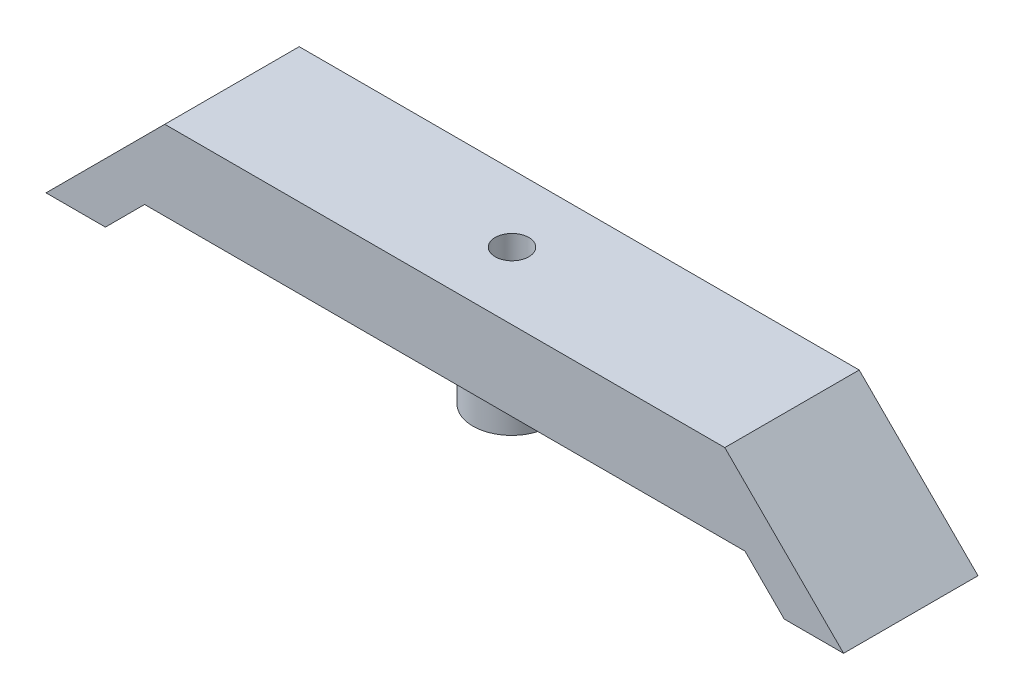
ISO-10303-21;
HEADER;
FILE_DESCRIPTION(('STEP AP214'),'2;1');
FILE_NAME('part.step','',(''),(''),'','','');
FILE_SCHEMA(('AUTOMOTIVE_DESIGN { 1 0 10303 214 1 1 1 1 }'));
ENDSEC;
DATA;
#1=APPLICATION_CONTEXT('core data for automotive mechanical design processes');
#2=APPLICATION_PROTOCOL_DEFINITION('international standard','automotive_design',2000,#1);
#3=PRODUCT_CONTEXT('',#1,'mechanical');
#4=PRODUCT('Part','Part','',(#3));
#5=PRODUCT_RELATED_PRODUCT_CATEGORY('part','',(#4));
#6=PRODUCT_DEFINITION_FORMATION('','',#4);
#7=PRODUCT_DEFINITION_CONTEXT('part definition',#1,'design');
#8=PRODUCT_DEFINITION('design','',#6,#7);
#9=PRODUCT_DEFINITION_SHAPE('','',#8);
#10=(LENGTH_UNIT() NAMED_UNIT(*) SI_UNIT(.MILLI.,.METRE.));
#11=(NAMED_UNIT(*) PLANE_ANGLE_UNIT() SI_UNIT($,.RADIAN.));
#12=(NAMED_UNIT(*) SI_UNIT($,.STERADIAN.) SOLID_ANGLE_UNIT());
#13=UNCERTAINTY_MEASURE_WITH_UNIT(LENGTH_MEASURE(1.E-05),#10,'distance_accuracy_value','');
#14=(GEOMETRIC_REPRESENTATION_CONTEXT(3) GLOBAL_UNCERTAINTY_ASSIGNED_CONTEXT((#13)) GLOBAL_UNIT_ASSIGNED_CONTEXT((#10,
#11,#12)) REPRESENTATION_CONTEXT('',''));
#15=CARTESIAN_POINT('',(0.,0.,0.));
#16=DIRECTION('',(0.,0.,1.));
#17=DIRECTION('',(1.,0.,0.));
#18=AXIS2_PLACEMENT_3D('',#15,#16,#17);
#19=CARTESIAN_POINT('',(-51.8024479254837,-7.10574878438281,12.));
#20=DIRECTION('',(0.,1.,0.));
#21=DIRECTION('',(0.,0.,1.));
#22=AXIS2_PLACEMENT_3D('',#19,#20,#21);
#23=PLANE('',#22);
#24=CARTESIAN_POINT('',(-25.,-7.10574878438281,6.));
#25=DIRECTION('',(0.,-1.,0.));
#26=DIRECTION('',(0.,0.,-1.));
#27=AXIS2_PLACEMENT_3D('',#24,#25,#26);
#28=CIRCLE('',#27,1.5);
#29=CARTESIAN_POINT('',(-24.9600605318817,-7.10574878438281,4.50053181464679));
#30=VERTEX_POINT('',#29);
#31=EDGE_CURVE('E225',#30,#30,#28,.T.);
#32=ORIENTED_EDGE('',*,*,#31,.F.);
#33=CARTESIAN_POINT('',(-25.0009057181842,-7.10574878438281,6.03400384797527));
#34=DIRECTION('',(0.,-1.,0.));
#35=DIRECTION('',(0.,0.,-1.));
#36=AXIS2_PLACEMENT_3D('',#33,#34,#35);
#37=CIRCLE('',#36,1.5340159080807);
#38=EDGE_CURVE('E55',#30,#30,#37,.T.);
#39=ORIENTED_EDGE('',*,*,#38,.T.);
#40=EDGE_LOOP('',(#32,#39));
#41=FACE_BOUND('',#40,.T.);
#42=ADVANCED_FACE('F41',(#41),#23,.F.);
#43=CARTESIAN_POINT('',(0.,0.,12.));
#44=DIRECTION('',(-0.707106781186547,-0.707106781186547,0.));
#45=DIRECTION('',(0.707106781186548,-0.707106781186548,0.));
#46=AXIS2_PLACEMENT_3D('',#43,#44,#45);
#47=PLANE('',#46);
#48=DIRECTION('',(-0.707106781186548,0.707106781186548,0.));
#49=VECTOR('',#48,1.);
#50=CARTESIAN_POINT('',(0.,0.,0.));
#51=LINE('',#50,#49);
#52=CARTESIAN_POINT('',(10.6066017177982,-10.6066017177982,0.));
#53=VERTEX_POINT('',#52);
#54=CARTESIAN_POINT('',(0.,0.,0.));
#55=VERTEX_POINT('',#54);
#56=EDGE_CURVE('E149',#53,#55,#51,.T.);
#57=ORIENTED_EDGE('',*,*,#56,.T.);
#58=DIRECTION('',(0.,0.,-1.));
#59=VECTOR('',#58,1.);
#60=CARTESIAN_POINT('',(0.,0.,12.));
#61=LINE('',#60,#59);
#62=CARTESIAN_POINT('',(0.,0.,12.));
#63=VERTEX_POINT('',#62);
#64=EDGE_CURVE('E50',#63,#55,#61,.T.);
#65=ORIENTED_EDGE('',*,*,#64,.F.);
#66=DIRECTION('',(-0.707106781186548,0.707106781186548,0.));
#67=VECTOR('',#66,1.);
#68=CARTESIAN_POINT('',(0.,0.,12.));
#69=LINE('',#68,#67);
#70=CARTESIAN_POINT('',(10.6066017177982,-10.6066017177982,12.));
#71=VERTEX_POINT('',#70);
#72=EDGE_CURVE('E173',#71,#63,#69,.T.);
#73=ORIENTED_EDGE('',*,*,#72,.F.);
#74=DIRECTION('',(0.,0.,-1.));
#75=VECTOR('',#74,1.);
#76=CARTESIAN_POINT('',(10.6066017177982,-10.6066017177982,12.));
#77=LINE('',#76,#75);
#78=EDGE_CURVE('E145',#71,#53,#77,.T.);
#79=ORIENTED_EDGE('',*,*,#78,.T.);
#80=EDGE_LOOP('',(#57,#65,#73,#79));
#81=FACE_BOUND('',#80,.T.);
#82=ADVANCED_FACE('F43',(#81),#47,.F.);
#83=CARTESIAN_POINT('',(0.,0.,12.));
#84=DIRECTION('',(0.,-1.,0.));
#85=DIRECTION('',(1.,0.,0.));
#86=AXIS2_PLACEMENT_3D('',#83,#84,#85);
#87=PLANE('',#86);
#88=CARTESIAN_POINT('',(-25.,0.,6.));
#89=DIRECTION('',(0.,-1.,0.));
#90=DIRECTION('',(1.,0.,0.));
#91=AXIS2_PLACEMENT_3D('',#88,#89,#90);
#92=CIRCLE('',#91,1.5);
#93=CARTESIAN_POINT('',(-23.5,0.,6.));
#94=VERTEX_POINT('',#93);
#95=EDGE_CURVE('E154',#94,#94,#92,.T.);
#96=ORIENTED_EDGE('',*,*,#95,.T.);
#97=EDGE_LOOP('',(#96));
#98=FACE_BOUND('',#97,.T.);
#99=DIRECTION('',(-1.,0.,0.));
#100=VECTOR('',#99,1.);
#101=CARTESIAN_POINT('',(0.,0.,0.));
#102=LINE('',#101,#100);
#103=CARTESIAN_POINT('',(-50.,0.,0.));
#104=VERTEX_POINT('',#103);
#105=EDGE_CURVE('E153',#55,#104,#102,.T.);
#106=ORIENTED_EDGE('',*,*,#105,.T.);
#107=DIRECTION('',(0.,0.,-1.));
#108=VECTOR('',#107,1.);
#109=CARTESIAN_POINT('',(-50.,0.,12.));
#110=LINE('',#109,#108);
#111=CARTESIAN_POINT('',(-50.,0.,12.));
#112=VERTEX_POINT('',#111);
#113=EDGE_CURVE('E188',#112,#104,#110,.T.);
#114=ORIENTED_EDGE('',*,*,#113,.F.);
#115=DIRECTION('',(-1.,0.,0.));
#116=VECTOR('',#115,1.);
#117=CARTESIAN_POINT('',(0.,0.,12.));
#118=LINE('',#117,#116);
#119=EDGE_CURVE('E104',#63,#112,#118,.T.);
#120=ORIENTED_EDGE('',*,*,#119,.F.);
#121=ORIENTED_EDGE('',*,*,#64,.T.);
#122=EDGE_LOOP('',(#106,#114,#120,#121));
#123=FACE_BOUND('',#122,.T.);
#124=ADVANCED_FACE('F193',(#98,#123),#87,.F.);
#125=CARTESIAN_POINT('',(-50.,0.,12.));
#126=DIRECTION('',(0.707106781186547,-0.707106781186548,0.));
#127=DIRECTION('',(0.707106781186548,0.707106781186547,0.));
#128=AXIS2_PLACEMENT_3D('',#125,#126,#127);
#129=PLANE('',#128);
#130=DIRECTION('',(-0.707106781186548,-0.707106781186547,0.));
#131=VECTOR('',#130,1.);
#132=CARTESIAN_POINT('',(-50.,0.,0.));
#133=LINE('',#132,#131);
#134=CARTESIAN_POINT('',(-60.6066017177982,-10.6066017177982,0.));
#135=VERTEX_POINT('',#134);
#136=EDGE_CURVE('E157',#104,#135,#133,.T.);
#137=ORIENTED_EDGE('',*,*,#136,.T.);
#138=DIRECTION('',(0.,0.,-1.));
#139=VECTOR('',#138,1.);
#140=CARTESIAN_POINT('',(-60.6066017177982,-10.6066017177982,12.));
#141=LINE('',#140,#139);
#142=CARTESIAN_POINT('',(-60.6066017177982,-10.6066017177982,12.));
#143=VERTEX_POINT('',#142);
#144=EDGE_CURVE('E184',#143,#135,#141,.T.);
#145=ORIENTED_EDGE('',*,*,#144,.F.);
#146=DIRECTION('',(-0.707106781186548,-0.707106781186547,0.));
#147=VECTOR('',#146,1.);
#148=CARTESIAN_POINT('',(-50.,0.,12.));
#149=LINE('',#148,#147);
#150=EDGE_CURVE('E212',#112,#143,#149,.T.);
#151=ORIENTED_EDGE('',*,*,#150,.F.);
#152=ORIENTED_EDGE('',*,*,#113,.T.);
#153=EDGE_LOOP('',(#137,#145,#151,#152));
#154=FACE_BOUND('',#153,.T.);
#155=ADVANCED_FACE('F204',(#154),#129,.F.);
#156=CARTESIAN_POINT('',(-60.6066017177982,-10.6066017177982,12.));
#157=DIRECTION('',(0.,1.,0.));
#158=DIRECTION('',(0.,0.,1.));
#159=AXIS2_PLACEMENT_3D('',#156,#157,#158);
#160=PLANE('',#159);
#161=DIRECTION('',(1.,0.,0.));
#162=VECTOR('',#161,1.);
#163=CARTESIAN_POINT('',(-60.6066017177982,-10.6066017177982,0.));
#164=LINE('',#163,#162);
#165=CARTESIAN_POINT('',(-55.3033008588991,-10.6066017177982,0.));
#166=VERTEX_POINT('',#165);
#167=EDGE_CURVE('E160',#135,#166,#164,.T.);
#168=ORIENTED_EDGE('',*,*,#167,.T.);
#169=DIRECTION('',(0.,0.,-1.));
#170=VECTOR('',#169,1.);
#171=CARTESIAN_POINT('',(-55.3033008588991,-10.6066017177982,12.));
#172=LINE('',#171,#170);
#173=CARTESIAN_POINT('',(-55.3033008588991,-10.6066017177982,12.));
#174=VERTEX_POINT('',#173);
#175=EDGE_CURVE('E180',#174,#166,#172,.T.);
#176=ORIENTED_EDGE('',*,*,#175,.F.);
#177=DIRECTION('',(1.,0.,0.));
#178=VECTOR('',#177,1.);
#179=CARTESIAN_POINT('',(-60.6066017177982,-10.6066017177982,12.));
#180=LINE('',#179,#178);
#181=EDGE_CURVE('E210',#143,#174,#180,.T.);
#182=ORIENTED_EDGE('',*,*,#181,.F.);
#183=ORIENTED_EDGE('',*,*,#144,.T.);
#184=EDGE_LOOP('',(#168,#176,#182,#183));
#185=FACE_BOUND('',#184,.T.);
#186=ADVANCED_FACE('F208',(#185),#160,.F.);
#187=CARTESIAN_POINT('',(-55.3033008588991,-10.6066017177982,12.));
#188=DIRECTION('',(-0.707106781186547,0.707106781186548,0.));
#189=DIRECTION('',(-0.707106781186548,-0.707106781186547,0.));
#190=AXIS2_PLACEMENT_3D('',#187,#188,#189);
#191=PLANE('',#190);
#192=DIRECTION('',(0.707106781186548,0.707106781186547,0.));
#193=VECTOR('',#192,1.);
#194=CARTESIAN_POINT('',(-55.3033008588991,-10.6066017177982,0.));
#195=LINE('',#194,#193);
#196=CARTESIAN_POINT('',(-51.8024479254837,-7.10574878438281,0.));
#197=VERTEX_POINT('',#196);
#198=EDGE_CURVE('E163',#166,#197,#195,.T.);
#199=ORIENTED_EDGE('',*,*,#198,.T.);
#200=DIRECTION('',(0.,0.,-1.));
#201=VECTOR('',#200,1.);
#202=CARTESIAN_POINT('',(-51.8024479254837,-7.10574878438281,12.));
#203=LINE('',#202,#201);
#204=CARTESIAN_POINT('',(-51.8024479254837,-7.10574878438281,12.));
#205=VERTEX_POINT('',#204);
#206=EDGE_CURVE('E138',#205,#197,#203,.T.);
#207=ORIENTED_EDGE('',*,*,#206,.F.);
#208=DIRECTION('',(0.707106781186548,0.707106781186547,0.));
#209=VECTOR('',#208,1.);
#210=CARTESIAN_POINT('',(-55.3033008588991,-10.6066017177982,12.));
#211=LINE('',#210,#209);
#212=EDGE_CURVE('E124',#174,#205,#211,.T.);
#213=ORIENTED_EDGE('',*,*,#212,.F.);
#214=ORIENTED_EDGE('',*,*,#175,.T.);
#215=EDGE_LOOP('',(#199,#207,#213,#214));
#216=FACE_BOUND('',#215,.T.);
#217=ADVANCED_FACE('F255',(#216),#191,.F.);
#218=CARTESIAN_POINT('',(-25.0009057181842,-7.10574878438281,6.03400384797527));
#219=DIRECTION('',(0.,1.,0.));
#220=DIRECTION('',(0.,0.,1.));
#221=AXIS2_PLACEMENT_3D('',#218,#219,#220);
#222=CIRCLE('',#221,3.45197048091293);
#223=CARTESIAN_POINT('',(-25.0009057181842,-7.10574878438281,9.48597432888821));
#224=VERTEX_POINT('',#223);
#225=EDGE_CURVE('E11',#224,#224,#222,.F.);
#226=ORIENTED_EDGE('',*,*,#225,.F.);
#227=EDGE_LOOP('',(#226));
#228=FACE_BOUND('',#227,.T.);
#229=DIRECTION('',(1.,0.,0.));
#230=VECTOR('',#229,1.);
#231=CARTESIAN_POINT('',(-51.8024479254837,-7.10574878438281,0.));
#232=LINE('',#231,#230);
#233=CARTESIAN_POINT('',(1.8024479254837,-7.10574878438281,0.));
#234=VERTEX_POINT('',#233);
#235=EDGE_CURVE('E134',#197,#234,#232,.T.);
#236=ORIENTED_EDGE('',*,*,#235,.T.);
#237=DIRECTION('',(0.,0.,-1.));
#238=VECTOR('',#237,1.);
#239=CARTESIAN_POINT('',(1.8024479254837,-7.10574878438281,12.));
#240=LINE('',#239,#238);
#241=CARTESIAN_POINT('',(1.8024479254837,-7.10574878438281,12.));
#242=VERTEX_POINT('',#241);
#243=EDGE_CURVE('E131',#242,#234,#240,.T.);
#244=ORIENTED_EDGE('',*,*,#243,.F.);
#245=DIRECTION('',(1.,0.,0.));
#246=VECTOR('',#245,1.);
#247=CARTESIAN_POINT('',(-51.8024479254837,-7.10574878438281,12.));
#248=LINE('',#247,#246);
#249=EDGE_CURVE('E117',#205,#242,#248,.T.);
#250=ORIENTED_EDGE('',*,*,#249,.F.);
#251=ORIENTED_EDGE('',*,*,#206,.T.);
#252=EDGE_LOOP('',(#236,#244,#250,#251));
#253=FACE_BOUND('',#252,.T.);
#254=ADVANCED_FACE('F132',(#228,#253),#23,.F.);
#255=CARTESIAN_POINT('',(5.30330085889911,-10.6066017177982,12.));
#256=DIRECTION('',(0.707106781186547,0.707106781186548,0.));
#257=DIRECTION('',(-0.707106781186548,0.707106781186547,0.));
#258=AXIS2_PLACEMENT_3D('',#255,#256,#257);
#259=PLANE('',#258);
#260=DIRECTION('',(0.707106781186548,-0.707106781186547,0.));
#261=VECTOR('',#260,1.);
#262=CARTESIAN_POINT('',(5.30330085889911,-10.6066017177982,0.));
#263=LINE('',#262,#261);
#264=CARTESIAN_POINT('',(5.30330085889911,-10.6066017177982,0.));
#265=VERTEX_POINT('',#264);
#266=EDGE_CURVE('E168',#234,#265,#263,.T.);
#267=ORIENTED_EDGE('',*,*,#266,.T.);
#268=DIRECTION('',(0.,0.,-1.));
#269=VECTOR('',#268,1.);
#270=CARTESIAN_POINT('',(5.30330085889911,-10.6066017177982,12.));
#271=LINE('',#270,#269);
#272=CARTESIAN_POINT('',(5.30330085889911,-10.6066017177982,12.));
#273=VERTEX_POINT('',#272);
#274=EDGE_CURVE('E139',#273,#265,#271,.T.);
#275=ORIENTED_EDGE('',*,*,#274,.F.);
#276=DIRECTION('',(0.707106781186548,-0.707106781186547,0.));
#277=VECTOR('',#276,1.);
#278=CARTESIAN_POINT('',(5.30330085889911,-10.6066017177982,12.));
#279=LINE('',#278,#277);
#280=EDGE_CURVE('E121',#242,#273,#279,.T.);
#281=ORIENTED_EDGE('',*,*,#280,.F.);
#282=ORIENTED_EDGE('',*,*,#243,.T.);
#283=EDGE_LOOP('',(#267,#275,#281,#282));
#284=FACE_BOUND('',#283,.T.);
#285=ADVANCED_FACE('F141',(#284),#259,.F.);
#286=CARTESIAN_POINT('',(10.6066017177982,-10.6066017177982,12.));
#287=DIRECTION('',(0.,1.,0.));
#288=DIRECTION('',(0.,0.,1.));
#289=AXIS2_PLACEMENT_3D('',#286,#287,#288);
#290=PLANE('',#289);
#291=DIRECTION('',(1.,0.,0.));
#292=VECTOR('',#291,1.);
#293=CARTESIAN_POINT('',(10.6066017177982,-10.6066017177982,0.));
#294=LINE('',#293,#292);
#295=EDGE_CURVE('E95',#265,#53,#294,.T.);
#296=ORIENTED_EDGE('',*,*,#295,.T.);
#297=ORIENTED_EDGE('',*,*,#78,.F.);
#298=DIRECTION('',(1.,0.,0.));
#299=VECTOR('',#298,1.);
#300=CARTESIAN_POINT('',(10.6066017177982,-10.6066017177982,12.));
#301=LINE('',#300,#299);
#302=EDGE_CURVE('E63',#273,#71,#301,.T.);
#303=ORIENTED_EDGE('',*,*,#302,.F.);
#304=ORIENTED_EDGE('',*,*,#274,.T.);
#305=EDGE_LOOP('',(#296,#297,#303,#304));
#306=FACE_BOUND('',#305,.T.);
#307=ADVANCED_FACE('F261',(#306),#290,.F.);
#308=CARTESIAN_POINT('',(0.,0.,12.));
#309=DIRECTION('',(0.,0.,1.));
#310=DIRECTION('',(1.,0.,0.));
#311=AXIS2_PLACEMENT_3D('',#308,#309,#310);
#312=PLANE('',#311);
#313=ORIENTED_EDGE('',*,*,#72,.T.);
#314=ORIENTED_EDGE('',*,*,#119,.T.);
#315=ORIENTED_EDGE('',*,*,#150,.T.);
#316=ORIENTED_EDGE('',*,*,#181,.T.);
#317=ORIENTED_EDGE('',*,*,#212,.T.);
#318=ORIENTED_EDGE('',*,*,#249,.T.);
#319=ORIENTED_EDGE('',*,*,#280,.T.);
#320=ORIENTED_EDGE('',*,*,#302,.T.);
#321=EDGE_LOOP('',(#313,#314,#315,#316,#317,#318,#319,#320));
#322=FACE_BOUND('',#321,.T.);
#323=ADVANCED_FACE('F119',(#322),#312,.T.);
#324=CARTESIAN_POINT('',(0.,0.,0.));
#325=DIRECTION('',(0.,0.,1.));
#326=DIRECTION('',(1.,0.,0.));
#327=AXIS2_PLACEMENT_3D('',#324,#325,#326);
#328=PLANE('',#327);
#329=ORIENTED_EDGE('',*,*,#56,.F.);
#330=ORIENTED_EDGE('',*,*,#295,.F.);
#331=ORIENTED_EDGE('',*,*,#266,.F.);
#332=ORIENTED_EDGE('',*,*,#235,.F.);
#333=ORIENTED_EDGE('',*,*,#198,.F.);
#334=ORIENTED_EDGE('',*,*,#167,.F.);
#335=ORIENTED_EDGE('',*,*,#136,.F.);
#336=ORIENTED_EDGE('',*,*,#105,.F.);
#337=EDGE_LOOP('',(#329,#330,#331,#332,#333,#334,#335,#336));
#338=FACE_BOUND('',#337,.T.);
#339=ADVANCED_FACE('F198',(#338),#328,.F.);
#340=CARTESIAN_POINT('',(-25.,4.89425121561719,6.));
#341=DIRECTION('',(0.,-1.,0.));
#342=DIRECTION('',(0.,0.,-1.));
#343=AXIS2_PLACEMENT_3D('',#340,#341,#342);
#344=CYLINDRICAL_SURFACE('',#343,1.5);
#345=ORIENTED_EDGE('',*,*,#31,.T.);
#346=EDGE_LOOP('',(#345));
#347=FACE_BOUND('',#346,.T.);
#348=ORIENTED_EDGE('',*,*,#95,.F.);
#349=EDGE_LOOP('',(#348));
#350=FACE_BOUND('',#349,.T.);
#351=ADVANCED_FACE('F272',(#347,#350),#344,.F.);
#352=CARTESIAN_POINT('',(-25.0009057181842,-12.1057487843828,6.03400384797527));
#353=DIRECTION('',(0.,1.,0.));
#354=DIRECTION('',(0.,0.,1.));
#355=AXIS2_PLACEMENT_3D('',#352,#353,#354);
#356=CYLINDRICAL_SURFACE('',#355,1.5340159080807);
#357=CARTESIAN_POINT('',(-25.0009057181842,-12.1057487843828,6.03400384797527));
#358=DIRECTION('',(0.,-1.,0.));
#359=DIRECTION('',(0.,0.,-1.));
#360=AXIS2_PLACEMENT_3D('',#357,#358,#359);
#361=CIRCLE('',#360,1.5340159080807);
#362=CARTESIAN_POINT('',(-25.0009057181842,-12.1057487843828,4.49998793989457));
#363=VERTEX_POINT('',#362);
#364=EDGE_CURVE('E232',#363,#363,#361,.T.);
#365=ORIENTED_EDGE('',*,*,#364,.T.);
#366=EDGE_LOOP('',(#365));
#367=FACE_BOUND('',#366,.T.);
#368=ORIENTED_EDGE('',*,*,#38,.F.);
#369=EDGE_LOOP('',(#368));
#370=FACE_BOUND('',#369,.T.);
#371=ADVANCED_FACE('F240',(#367,#370),#356,.F.);
#372=CARTESIAN_POINT('',(-25.0009057181842,-12.1057487843828,6.03400384797527));
#373=DIRECTION('',(0.,1.,0.));
#374=DIRECTION('',(0.,0.,1.));
#375=AXIS2_PLACEMENT_3D('',#372,#373,#374);
#376=CYLINDRICAL_SURFACE('',#375,3.45197048091293);
#377=CARTESIAN_POINT('',(-25.0009057181842,-12.1057487843828,6.03400384797527));
#378=DIRECTION('',(0.,-1.,0.));
#379=DIRECTION('',(0.,0.,-1.));
#380=AXIS2_PLACEMENT_3D('',#377,#378,#379);
#381=CIRCLE('',#380,3.45197048091293);
#382=CARTESIAN_POINT('',(-25.0009057181842,-12.1057487843828,2.58203336706234));
#383=VERTEX_POINT('',#382);
#384=EDGE_CURVE('E229',#383,#383,#381,.T.);
#385=ORIENTED_EDGE('',*,*,#384,.F.);
#386=EDGE_LOOP('',(#385));
#387=FACE_BOUND('',#386,.T.);
#388=ORIENTED_EDGE('',*,*,#225,.T.);
#389=EDGE_LOOP('',(#388));
#390=FACE_BOUND('',#389,.T.);
#391=ADVANCED_FACE('F245',(#387,#390),#376,.T.);
#392=CARTESIAN_POINT('',(0.,-12.1057487843828,0.));
#393=DIRECTION('',(0.,-1.,0.));
#394=DIRECTION('',(0.,0.,-1.));
#395=AXIS2_PLACEMENT_3D('',#392,#393,#394);
#396=PLANE('',#395);
#397=ORIENTED_EDGE('',*,*,#364,.F.);
#398=EDGE_LOOP('',(#397));
#399=FACE_BOUND('',#398,.T.);
#400=ORIENTED_EDGE('',*,*,#384,.T.);
#401=EDGE_LOOP('',(#400));
#402=FACE_BOUND('',#401,.T.);
#403=ADVANCED_FACE('F242',(#399,#402),#396,.T.);
#404=CLOSED_SHELL('',(#42,#82,#124,#155,#186,#217,#254,#285,#307,#323,#339,#351,#371,#391,#403));
#405=MANIFOLD_SOLID_BREP('B2',#404);
#406=ADVANCED_BREP_SHAPE_REPRESENTATION('',(#18,#405),#14);
#407=SHAPE_DEFINITION_REPRESENTATION(#9,#406);
ENDSEC;
END-ISO-10303-21;
